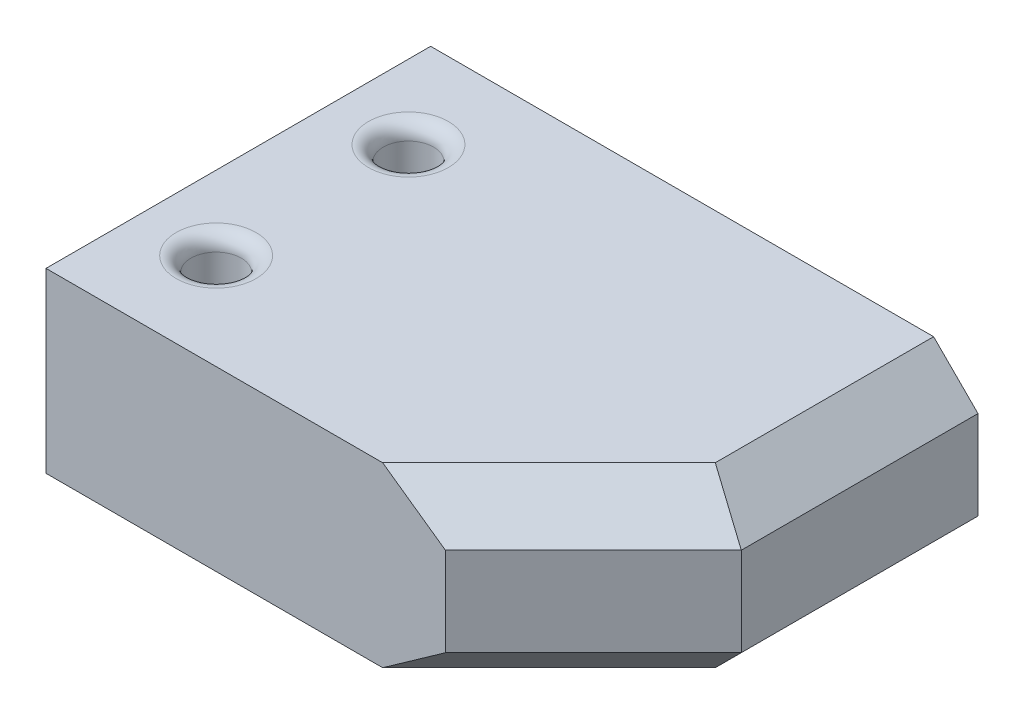
ISO-10303-21;
HEADER;
FILE_DESCRIPTION(('STEP AP214'),'2;1');
FILE_NAME('part.step','',(''),(''),'','','');
FILE_SCHEMA(('AUTOMOTIVE_DESIGN { 1 0 10303 214 1 1 1 1 }'));
ENDSEC;
DATA;
#1=APPLICATION_CONTEXT('core data for automotive mechanical design processes');
#2=APPLICATION_PROTOCOL_DEFINITION('international standard','automotive_design',2000,#1);
#3=PRODUCT_CONTEXT('',#1,'mechanical');
#4=PRODUCT('Part','Part','',(#3));
#5=PRODUCT_RELATED_PRODUCT_CATEGORY('part','',(#4));
#6=PRODUCT_DEFINITION_FORMATION('','',#4);
#7=PRODUCT_DEFINITION_CONTEXT('part definition',#1,'design');
#8=PRODUCT_DEFINITION('design','',#6,#7);
#9=PRODUCT_DEFINITION_SHAPE('','',#8);
#10=(LENGTH_UNIT() NAMED_UNIT(*) SI_UNIT(.MILLI.,.METRE.));
#11=(NAMED_UNIT(*) PLANE_ANGLE_UNIT() SI_UNIT($,.RADIAN.));
#12=(NAMED_UNIT(*) SI_UNIT($,.STERADIAN.) SOLID_ANGLE_UNIT());
#13=UNCERTAINTY_MEASURE_WITH_UNIT(LENGTH_MEASURE(1.E-05),#10,'distance_accuracy_value','');
#14=(GEOMETRIC_REPRESENTATION_CONTEXT(3) GLOBAL_UNCERTAINTY_ASSIGNED_CONTEXT((#13)) GLOBAL_UNIT_ASSIGNED_CONTEXT((#10,
#11,#12)) REPRESENTATION_CONTEXT('',''));
#15=CARTESIAN_POINT('',(0.,0.,0.));
#16=DIRECTION('',(0.,0.,1.));
#17=DIRECTION('',(1.,0.,0.));
#18=AXIS2_PLACEMENT_3D('',#15,#16,#17);
#19=CARTESIAN_POINT('',(0.,6.,-6.5));
#20=DIRECTION('',(0.,0.,1.));
#21=DIRECTION('',(1.,0.,0.));
#22=AXIS2_PLACEMENT_3D('',#19,#20,#21);
#23=PLANE('',#22);
#24=DIRECTION('',(0.,-1.,0.));
#25=VECTOR('',#24,1.);
#26=CARTESIAN_POINT('',(18.5,6.,-6.5));
#27=LINE('',#26,#25);
#28=CARTESIAN_POINT('',(18.5,4.5,-6.5));
#29=VERTEX_POINT('',#28);
#30=CARTESIAN_POINT('',(18.5,1.5,-6.5));
#31=VERTEX_POINT('',#30);
#32=EDGE_CURVE('E128',#29,#31,#27,.T.);
#33=ORIENTED_EDGE('',*,*,#32,.T.);
#34=DIRECTION('',(-0.707106781186546,-0.707106781186549,0.));
#35=VECTOR('',#34,1.);
#36=CARTESIAN_POINT('',(18.5,1.5,-6.5));
#37=LINE('',#36,#35);
#38=CARTESIAN_POINT('',(17.,0.,-6.5));
#39=VERTEX_POINT('',#38);
#40=EDGE_CURVE('E164',#31,#39,#37,.T.);
#41=ORIENTED_EDGE('',*,*,#40,.T.);
#42=DIRECTION('',(-1.,0.,0.));
#43=VECTOR('',#42,1.);
#44=CARTESIAN_POINT('',(0.,0.,-6.5));
#45=LINE('',#44,#43);
#46=CARTESIAN_POINT('',(0.,0.,-6.5));
#47=VERTEX_POINT('',#46);
#48=EDGE_CURVE('E121',#39,#47,#45,.T.);
#49=ORIENTED_EDGE('',*,*,#48,.T.);
#50=DIRECTION('',(0.,-1.,0.));
#51=VECTOR('',#50,1.);
#52=CARTESIAN_POINT('',(0.,6.,-6.5));
#53=LINE('',#52,#51);
#54=CARTESIAN_POINT('',(0.,6.,-6.5));
#55=VERTEX_POINT('',#54);
#56=EDGE_CURVE('E114',#55,#47,#53,.T.);
#57=ORIENTED_EDGE('',*,*,#56,.F.);
#58=DIRECTION('',(-1.,0.,0.));
#59=VECTOR('',#58,1.);
#60=CARTESIAN_POINT('',(0.,6.,-6.5));
#61=LINE('',#60,#59);
#62=CARTESIAN_POINT('',(17.,6.,-6.5));
#63=VERTEX_POINT('',#62);
#64=EDGE_CURVE('E101',#63,#55,#61,.T.);
#65=ORIENTED_EDGE('',*,*,#64,.F.);
#66=DIRECTION('',(-0.707106781186545,0.70710678118655,0.));
#67=VECTOR('',#66,1.);
#68=CARTESIAN_POINT('',(17.,6.,-6.5));
#69=LINE('',#68,#67);
#70=EDGE_CURVE('E162',#63,#29,#69,.F.);
#71=ORIENTED_EDGE('',*,*,#70,.T.);
#72=EDGE_LOOP('',(#33,#41,#49,#57,#65,#71));
#73=FACE_BOUND('',#72,.T.);
#74=ADVANCED_FACE('F34',(#73),#23,.F.);
#75=CARTESIAN_POINT('',(0.,6.,6.5));
#76=DIRECTION('',(1.,0.,0.));
#77=DIRECTION('',(0.,0.,-1.));
#78=AXIS2_PLACEMENT_3D('',#75,#76,#77);
#79=PLANE('',#78);
#80=DIRECTION('',(0.,0.,1.));
#81=VECTOR('',#80,1.);
#82=CARTESIAN_POINT('',(0.,0.,6.5));
#83=LINE('',#82,#81);
#84=CARTESIAN_POINT('',(0.,0.,6.5));
#85=VERTEX_POINT('',#84);
#86=EDGE_CURVE('E183',#47,#85,#83,.T.);
#87=ORIENTED_EDGE('',*,*,#86,.T.);
#88=DIRECTION('',(0.,-1.,0.));
#89=VECTOR('',#88,1.);
#90=CARTESIAN_POINT('',(0.,6.,6.5));
#91=LINE('',#90,#89);
#92=CARTESIAN_POINT('',(0.,6.,6.5));
#93=VERTEX_POINT('',#92);
#94=EDGE_CURVE('E116',#93,#85,#91,.T.);
#95=ORIENTED_EDGE('',*,*,#94,.F.);
#96=DIRECTION('',(0.,0.,1.));
#97=VECTOR('',#96,1.);
#98=CARTESIAN_POINT('',(0.,6.,6.5));
#99=LINE('',#98,#97);
#100=EDGE_CURVE('E104',#55,#93,#99,.T.);
#101=ORIENTED_EDGE('',*,*,#100,.F.);
#102=ORIENTED_EDGE('',*,*,#56,.T.);
#103=EDGE_LOOP('',(#87,#95,#101,#102));
#104=FACE_BOUND('',#103,.T.);
#105=ADVANCED_FACE('F113',(#104),#79,.F.);
#106=CARTESIAN_POINT('',(18.5,6.,6.49999999999999));
#107=DIRECTION('',(0.,0.,-1.));
#108=DIRECTION('',(-1.,0.,0.));
#109=AXIS2_PLACEMENT_3D('',#106,#107,#108);
#110=PLANE('',#109);
#111=DIRECTION('',(1.,0.,0.));
#112=VECTOR('',#111,1.);
#113=CARTESIAN_POINT('',(18.5,0.,6.49999999999999));
#114=LINE('',#113,#112);
#115=CARTESIAN_POINT('',(11.3786796564403,0.,6.5));
#116=VERTEX_POINT('',#115);
#117=EDGE_CURVE('E109',#85,#116,#114,.T.);
#118=ORIENTED_EDGE('',*,*,#117,.T.);
#119=DIRECTION('',(0.816496580927726,0.577350269189626,0.));
#120=VECTOR('',#119,1.);
#121=CARTESIAN_POINT('',(9.75245310429355,-1.14991582276861,6.5));
#122=LINE('',#121,#120);
#123=CARTESIAN_POINT('',(13.5,1.5,6.49999999999999));
#124=VERTEX_POINT('',#123);
#125=EDGE_CURVE('E171',#116,#124,#122,.T.);
#126=ORIENTED_EDGE('',*,*,#125,.T.);
#127=DIRECTION('',(0.,1.,0.));
#128=VECTOR('',#127,1.);
#129=CARTESIAN_POINT('',(13.5,6.,6.49999999999999));
#130=LINE('',#129,#128);
#131=CARTESIAN_POINT('',(13.5,4.5,6.49999999999999));
#132=VERTEX_POINT('',#131);
#133=EDGE_CURVE('E155',#124,#132,#130,.T.);
#134=ORIENTED_EDGE('',*,*,#133,.T.);
#135=DIRECTION('',(0.816496580927725,-0.577350269189628,0.));
#136=VECTOR('',#135,1.);
#137=CARTESIAN_POINT('',(9.75245310429356,7.14991582276862,6.5));
#138=LINE('',#137,#136);
#139=CARTESIAN_POINT('',(11.3786796564403,6.,6.5));
#140=VERTEX_POINT('',#139);
#141=EDGE_CURVE('E58',#132,#140,#138,.F.);
#142=ORIENTED_EDGE('',*,*,#141,.T.);
#143=DIRECTION('',(1.,0.,0.));
#144=VECTOR('',#143,1.);
#145=CARTESIAN_POINT('',(18.5,6.,6.49999999999999));
#146=LINE('',#145,#144);
#147=EDGE_CURVE('E117',#93,#140,#146,.T.);
#148=ORIENTED_EDGE('',*,*,#147,.F.);
#149=ORIENTED_EDGE('',*,*,#94,.T.);
#150=EDGE_LOOP('',(#118,#126,#134,#142,#148,#149));
#151=FACE_BOUND('',#150,.T.);
#152=ADVANCED_FACE('F197',(#151),#110,.F.);
#153=CARTESIAN_POINT('',(18.5,6.,-6.5));
#154=DIRECTION('',(-1.,0.,0.));
#155=DIRECTION('',(0.,0.,1.));
#156=AXIS2_PLACEMENT_3D('',#153,#154,#155);
#157=PLANE('',#156);
#158=DIRECTION('',(0.,-1.,0.));
#159=VECTOR('',#158,1.);
#160=CARTESIAN_POINT('',(18.5,6.,1.5));
#161=LINE('',#160,#159);
#162=CARTESIAN_POINT('',(18.5,4.5,1.5));
#163=VERTEX_POINT('',#162);
#164=CARTESIAN_POINT('',(18.5,1.5,1.5));
#165=VERTEX_POINT('',#164);
#166=EDGE_CURVE('E152',#163,#165,#161,.T.);
#167=ORIENTED_EDGE('',*,*,#166,.T.);
#168=DIRECTION('',(0.,0.,-1.));
#169=VECTOR('',#168,1.);
#170=CARTESIAN_POINT('',(18.5,1.5,-6.5));
#171=LINE('',#170,#169);
#172=EDGE_CURVE('E159',#165,#31,#171,.T.);
#173=ORIENTED_EDGE('',*,*,#172,.T.);
#174=ORIENTED_EDGE('',*,*,#32,.F.);
#175=DIRECTION('',(0.,0.,1.));
#176=VECTOR('',#175,1.);
#177=CARTESIAN_POINT('',(18.5,4.5,-6.5));
#178=LINE('',#177,#176);
#179=EDGE_CURVE('E157',#29,#163,#178,.T.);
#180=ORIENTED_EDGE('',*,*,#179,.T.);
#181=EDGE_LOOP('',(#167,#173,#174,#180));
#182=FACE_BOUND('',#181,.T.);
#183=ADVANCED_FACE('F204',(#182),#157,.F.);
#184=CARTESIAN_POINT('',(0.,6.,0.));
#185=DIRECTION('',(0.,-1.,0.));
#186=DIRECTION('',(0.,0.,-1.));
#187=AXIS2_PLACEMENT_3D('',#184,#185,#186);
#188=PLANE('',#187);
#189=CARTESIAN_POINT('',(2.5,6.,3.25));
#190=DIRECTION('',(0.,-1.,0.));
#191=DIRECTION('',(0.,0.,-1.));
#192=AXIS2_PLACEMENT_3D('',#189,#190,#191);
#193=CIRCLE('',#192,1.35);
#194=CARTESIAN_POINT('',(2.5,6.,1.9));
#195=VERTEX_POINT('',#194);
#196=EDGE_CURVE('E149',#195,#195,#193,.T.);
#197=ORIENTED_EDGE('',*,*,#196,.T.);
#198=EDGE_LOOP('',(#197));
#199=FACE_BOUND('',#198,.T.);
#200=CARTESIAN_POINT('',(2.5,6.,-3.25));
#201=DIRECTION('',(0.,-1.,0.));
#202=DIRECTION('',(0.,0.,-1.));
#203=AXIS2_PLACEMENT_3D('',#200,#201,#202);
#204=CIRCLE('',#203,1.35);
#205=CARTESIAN_POINT('',(2.5,6.,-4.6));
#206=VERTEX_POINT('',#205);
#207=EDGE_CURVE('E146',#206,#206,#204,.T.);
#208=ORIENTED_EDGE('',*,*,#207,.T.);
#209=EDGE_LOOP('',(#208));
#210=FACE_BOUND('',#209,.T.);
#211=DIRECTION('',(0.707106781186548,0.,-0.707106781186547));
#212=VECTOR('',#211,1.);
#213=CARTESIAN_POINT('',(17.4393398282202,6.,0.439339828220175));
#214=LINE('',#213,#212);
#215=CARTESIAN_POINT('',(17.,6.,0.878679656440355));
#216=VERTEX_POINT('',#215);
#217=EDGE_CURVE('E44',#140,#216,#214,.T.);
#218=ORIENTED_EDGE('',*,*,#217,.T.);
#219=DIRECTION('',(0.,0.,-1.));
#220=VECTOR('',#219,1.);
#221=CARTESIAN_POINT('',(17.,6.,0.));
#222=LINE('',#221,#220);
#223=EDGE_CURVE('E11',#216,#63,#222,.T.);
#224=ORIENTED_EDGE('',*,*,#223,.T.);
#225=ORIENTED_EDGE('',*,*,#64,.T.);
#226=ORIENTED_EDGE('',*,*,#100,.T.);
#227=ORIENTED_EDGE('',*,*,#147,.T.);
#228=EDGE_LOOP('',(#218,#224,#225,#226,#227));
#229=FACE_BOUND('',#228,.T.);
#230=ADVANCED_FACE('F103',(#199,#210,#229),#188,.F.);
#231=CARTESIAN_POINT('',(0.,0.,0.));
#232=DIRECTION('',(0.,-1.,0.));
#233=DIRECTION('',(0.,0.,-1.));
#234=AXIS2_PLACEMENT_3D('',#231,#232,#233);
#235=PLANE('',#234);
#236=CARTESIAN_POINT('',(2.5,0.,3.25));
#237=DIRECTION('',(0.,-1.,0.));
#238=DIRECTION('',(0.,0.,-1.));
#239=AXIS2_PLACEMENT_3D('',#236,#237,#238);
#240=CIRCLE('',#239,1.35);
#241=CARTESIAN_POINT('',(2.5,0.,1.9));
#242=VERTEX_POINT('',#241);
#243=EDGE_CURVE('E126',#242,#242,#240,.F.);
#244=ORIENTED_EDGE('',*,*,#243,.T.);
#245=EDGE_LOOP('',(#244));
#246=FACE_BOUND('',#245,.T.);
#247=CARTESIAN_POINT('',(2.5,0.,-3.25));
#248=DIRECTION('',(0.,-1.,0.));
#249=DIRECTION('',(0.,0.,-1.));
#250=AXIS2_PLACEMENT_3D('',#247,#248,#249);
#251=CIRCLE('',#250,1.35);
#252=CARTESIAN_POINT('',(2.5,0.,-4.6));
#253=VERTEX_POINT('',#252);
#254=EDGE_CURVE('E123',#253,#253,#251,.F.);
#255=ORIENTED_EDGE('',*,*,#254,.T.);
#256=EDGE_LOOP('',(#255));
#257=FACE_BOUND('',#256,.T.);
#258=ORIENTED_EDGE('',*,*,#48,.F.);
#259=DIRECTION('',(0.,0.,1.));
#260=VECTOR('',#259,1.);
#261=CARTESIAN_POINT('',(17.,0.,1.49999999999999));
#262=LINE('',#261,#260);
#263=CARTESIAN_POINT('',(17.,0.,0.878679656440348));
#264=VERTEX_POINT('',#263);
#265=EDGE_CURVE('E168',#39,#264,#262,.T.);
#266=ORIENTED_EDGE('',*,*,#265,.T.);
#267=DIRECTION('',(-0.707106781186548,0.,0.707106781186547));
#268=VECTOR('',#267,1.);
#269=CARTESIAN_POINT('',(8.93933982822015,0.,8.93933982822017));
#270=LINE('',#269,#268);
#271=EDGE_CURVE('E166',#264,#116,#270,.T.);
#272=ORIENTED_EDGE('',*,*,#271,.T.);
#273=ORIENTED_EDGE('',*,*,#117,.F.);
#274=ORIENTED_EDGE('',*,*,#86,.F.);
#275=EDGE_LOOP('',(#258,#266,#272,#273,#274));
#276=FACE_BOUND('',#275,.T.);
#277=ADVANCED_FACE('F210',(#246,#257,#276),#235,.T.);
#278=CARTESIAN_POINT('',(2.5,0.,3.25));
#279=DIRECTION('',(0.,1.,0.));
#280=DIRECTION('',(0.,0.,1.));
#281=AXIS2_PLACEMENT_3D('',#278,#279,#280);
#282=CYLINDRICAL_SURFACE('',#281,0.85);
#283=CARTESIAN_POINT('',(2.5,0.5,3.25));
#284=DIRECTION('',(0.,-1.,0.));
#285=DIRECTION('',(0.,0.,-1.));
#286=AXIS2_PLACEMENT_3D('',#283,#284,#285);
#287=CIRCLE('',#286,0.85);
#288=CARTESIAN_POINT('',(2.5,0.5,2.4));
#289=VERTEX_POINT('',#288);
#290=EDGE_CURVE('E137',#289,#289,#287,.T.);
#291=ORIENTED_EDGE('',*,*,#290,.T.);
#292=EDGE_LOOP('',(#291));
#293=FACE_BOUND('',#292,.T.);
#294=CARTESIAN_POINT('',(2.5,5.5,3.25));
#295=DIRECTION('',(0.,-1.,0.));
#296=DIRECTION('',(0.,0.,-1.));
#297=AXIS2_PLACEMENT_3D('',#294,#295,#296);
#298=CIRCLE('',#297,0.85);
#299=CARTESIAN_POINT('',(2.5,5.5,2.4));
#300=VERTEX_POINT('',#299);
#301=EDGE_CURVE('E134',#300,#300,#298,.F.);
#302=ORIENTED_EDGE('',*,*,#301,.T.);
#303=EDGE_LOOP('',(#302));
#304=FACE_BOUND('',#303,.T.);
#305=ADVANCED_FACE('F316',(#293,#304),#282,.F.);
#306=CARTESIAN_POINT('',(2.5,0.,-3.25));
#307=DIRECTION('',(0.,1.,0.));
#308=DIRECTION('',(0.,0.,1.));
#309=AXIS2_PLACEMENT_3D('',#306,#307,#308);
#310=CYLINDRICAL_SURFACE('',#309,0.85);
#311=CARTESIAN_POINT('',(2.5,0.5,-3.25));
#312=DIRECTION('',(0.,-1.,0.));
#313=DIRECTION('',(0.,0.,-1.));
#314=AXIS2_PLACEMENT_3D('',#311,#312,#313);
#315=CIRCLE('',#314,0.85);
#316=CARTESIAN_POINT('',(2.5,0.5,-4.1));
#317=VERTEX_POINT('',#316);
#318=EDGE_CURVE('E143',#317,#317,#315,.T.);
#319=ORIENTED_EDGE('',*,*,#318,.T.);
#320=EDGE_LOOP('',(#319));
#321=FACE_BOUND('',#320,.T.);
#322=CARTESIAN_POINT('',(2.5,5.5,-3.25));
#323=DIRECTION('',(0.,-1.,0.));
#324=DIRECTION('',(0.,0.,-1.));
#325=AXIS2_PLACEMENT_3D('',#322,#323,#324);
#326=CIRCLE('',#325,0.85);
#327=CARTESIAN_POINT('',(2.5,5.5,-4.1));
#328=VERTEX_POINT('',#327);
#329=EDGE_CURVE('E140',#328,#328,#326,.F.);
#330=ORIENTED_EDGE('',*,*,#329,.T.);
#331=EDGE_LOOP('',(#330));
#332=FACE_BOUND('',#331,.T.);
#333=ADVANCED_FACE('F233',(#321,#332),#310,.F.);
#334=CARTESIAN_POINT('',(2.5,0.5,3.25));
#335=DIRECTION('',(0.,-1.,0.));
#336=DIRECTION('',(0.,0.,-1.));
#337=AXIS2_PLACEMENT_3D('',#334,#335,#336);
#338=TOROIDAL_SURFACE('',#337,1.35,0.5);
#339=ORIENTED_EDGE('',*,*,#290,.F.);
#340=EDGE_LOOP('',(#339));
#341=FACE_BOUND('',#340,.T.);
#342=ORIENTED_EDGE('',*,*,#243,.F.);
#343=EDGE_LOOP('',(#342));
#344=FACE_BOUND('',#343,.T.);
#345=ADVANCED_FACE('F229',(#341,#344),#338,.T.);
#346=CARTESIAN_POINT('',(2.5,0.5,-3.25));
#347=DIRECTION('',(0.,-1.,0.));
#348=DIRECTION('',(0.,0.,-1.));
#349=AXIS2_PLACEMENT_3D('',#346,#347,#348);
#350=TOROIDAL_SURFACE('',#349,1.35,0.5);
#351=ORIENTED_EDGE('',*,*,#318,.F.);
#352=EDGE_LOOP('',(#351));
#353=FACE_BOUND('',#352,.T.);
#354=ORIENTED_EDGE('',*,*,#254,.F.);
#355=EDGE_LOOP('',(#354));
#356=FACE_BOUND('',#355,.T.);
#357=ADVANCED_FACE('F232',(#353,#356),#350,.T.);
#358=CARTESIAN_POINT('',(2.5,5.5,3.25));
#359=DIRECTION('',(0.,-1.,0.));
#360=DIRECTION('',(0.,0.,-1.));
#361=AXIS2_PLACEMENT_3D('',#358,#359,#360);
#362=TOROIDAL_SURFACE('',#361,1.35,0.5);
#363=ORIENTED_EDGE('',*,*,#301,.F.);
#364=EDGE_LOOP('',(#363));
#365=FACE_BOUND('',#364,.T.);
#366=ORIENTED_EDGE('',*,*,#196,.F.);
#367=EDGE_LOOP('',(#366));
#368=FACE_BOUND('',#367,.T.);
#369=ADVANCED_FACE('F237',(#365,#368),#362,.T.);
#370=CARTESIAN_POINT('',(2.5,5.5,-3.25));
#371=DIRECTION('',(0.,-1.,0.));
#372=DIRECTION('',(0.,0.,-1.));
#373=AXIS2_PLACEMENT_3D('',#370,#371,#372);
#374=TOROIDAL_SURFACE('',#373,1.35,0.5);
#375=ORIENTED_EDGE('',*,*,#329,.F.);
#376=EDGE_LOOP('',(#375));
#377=FACE_BOUND('',#376,.T.);
#378=ORIENTED_EDGE('',*,*,#207,.F.);
#379=EDGE_LOOP('',(#378));
#380=FACE_BOUND('',#379,.T.);
#381=ADVANCED_FACE('F241',(#377,#380),#374,.T.);
#382=CARTESIAN_POINT('',(18.5,6.,1.49999999999999));
#383=DIRECTION('',(-0.707106781186547,0.,-0.707106781186548));
#384=DIRECTION('',(0.,-1.,0.));
#385=AXIS2_PLACEMENT_3D('',#382,#383,#384);
#386=PLANE('',#385);
#387=ORIENTED_EDGE('',*,*,#133,.F.);
#388=DIRECTION('',(-0.707106781186548,0.,0.707106781186547));
#389=VECTOR('',#388,1.);
#390=CARTESIAN_POINT('',(18.5,1.5,1.49999999999999));
#391=LINE('',#390,#389);
#392=EDGE_CURVE('E175',#124,#165,#391,.F.);
#393=ORIENTED_EDGE('',*,*,#392,.T.);
#394=ORIENTED_EDGE('',*,*,#166,.F.);
#395=DIRECTION('',(0.707106781186548,0.,-0.707106781186547));
#396=VECTOR('',#395,1.);
#397=CARTESIAN_POINT('',(13.5,4.5,6.49999999999999));
#398=LINE('',#397,#396);
#399=EDGE_CURVE('E173',#163,#132,#398,.F.);
#400=ORIENTED_EDGE('',*,*,#399,.T.);
#401=EDGE_LOOP('',(#387,#393,#394,#400));
#402=FACE_BOUND('',#401,.T.);
#403=ADVANCED_FACE('F194',(#402),#386,.F.);
#404=CARTESIAN_POINT('',(8.93933982822015,0.,8.93933982822017));
#405=DIRECTION('',(0.5,-0.707106781186547,0.500000000000001));
#406=DIRECTION('',(0.707106781186548,0.,-0.707106781186547));
#407=AXIS2_PLACEMENT_3D('',#404,#405,#406);
#408=PLANE('',#407);
#409=ORIENTED_EDGE('',*,*,#125,.F.);
#410=ORIENTED_EDGE('',*,*,#271,.F.);
#411=DIRECTION('',(0.678598344545846,0.678598344545848,0.281084637714822));
#412=VECTOR('',#411,1.);
#413=CARTESIAN_POINT('',(14.8256196415255,-2.17438035847454,-0.0219781777974822));
#414=LINE('',#413,#412);
#415=EDGE_CURVE('E177',#165,#264,#414,.F.);
#416=ORIENTED_EDGE('',*,*,#415,.F.);
#417=ORIENTED_EDGE('',*,*,#392,.F.);
#418=EDGE_LOOP('',(#409,#410,#416,#417));
#419=FACE_BOUND('',#418,.T.);
#420=ADVANCED_FACE('F202',(#419),#408,.T.);
#421=CARTESIAN_POINT('',(18.5,1.5,-6.5));
#422=DIRECTION('',(0.707106781186549,-0.707106781186546,0.));
#423=DIRECTION('',(0.,0.,1.));
#424=AXIS2_PLACEMENT_3D('',#421,#422,#423);
#425=PLANE('',#424);
#426=ORIENTED_EDGE('',*,*,#415,.T.);
#427=ORIENTED_EDGE('',*,*,#265,.F.);
#428=ORIENTED_EDGE('',*,*,#40,.F.);
#429=ORIENTED_EDGE('',*,*,#172,.F.);
#430=EDGE_LOOP('',(#426,#427,#428,#429));
#431=FACE_BOUND('',#430,.T.);
#432=ADVANCED_FACE('F211',(#431),#425,.T.);
#433=CARTESIAN_POINT('',(8.93933982822016,6.,8.93933982822018));
#434=DIRECTION('',(-0.500000000000001,-0.707106781186545,-0.500000000000002));
#435=DIRECTION('',(0.707106781186548,0.,-0.707106781186547));
#436=AXIS2_PLACEMENT_3D('',#433,#434,#435);
#437=PLANE('',#436);
#438=ORIENTED_EDGE('',*,*,#141,.F.);
#439=ORIENTED_EDGE('',*,*,#399,.F.);
#440=DIRECTION('',(-0.678598344545845,0.678598344545849,-0.281084637714819));
#441=VECTOR('',#440,1.);
#442=CARTESIAN_POINT('',(14.8256196415255,8.17438035847456,-0.0219781777974735));
#443=LINE('',#442,#441);
#444=EDGE_CURVE('E39',#216,#163,#443,.F.);
#445=ORIENTED_EDGE('',*,*,#444,.F.);
#446=ORIENTED_EDGE('',*,*,#217,.F.);
#447=EDGE_LOOP('',(#438,#439,#445,#446));
#448=FACE_BOUND('',#447,.T.);
#449=ADVANCED_FACE('F37',(#448),#437,.F.);
#450=CARTESIAN_POINT('',(17.,6.,0.));
#451=DIRECTION('',(-0.70710678118655,-0.707106781186545,0.));
#452=DIRECTION('',(0.,0.,-1.));
#453=AXIS2_PLACEMENT_3D('',#450,#451,#452);
#454=PLANE('',#453);
#455=ORIENTED_EDGE('',*,*,#444,.T.);
#456=ORIENTED_EDGE('',*,*,#179,.F.);
#457=ORIENTED_EDGE('',*,*,#70,.F.);
#458=ORIENTED_EDGE('',*,*,#223,.F.);
#459=EDGE_LOOP('',(#455,#456,#457,#458));
#460=FACE_BOUND('',#459,.T.);
#461=ADVANCED_FACE('F188',(#460),#454,.F.);
#462=CLOSED_SHELL('',(#74,#105,#152,#183,#230,#277,#305,#333,#345,#357,#369,#381,#403,#420,#432,
#449,#461));
#463=MANIFOLD_SOLID_BREP('B2',#462);
#464=ADVANCED_BREP_SHAPE_REPRESENTATION('',(#18,#463),#14);
#465=SHAPE_DEFINITION_REPRESENTATION(#9,#464);
ENDSEC;
END-ISO-10303-21;
